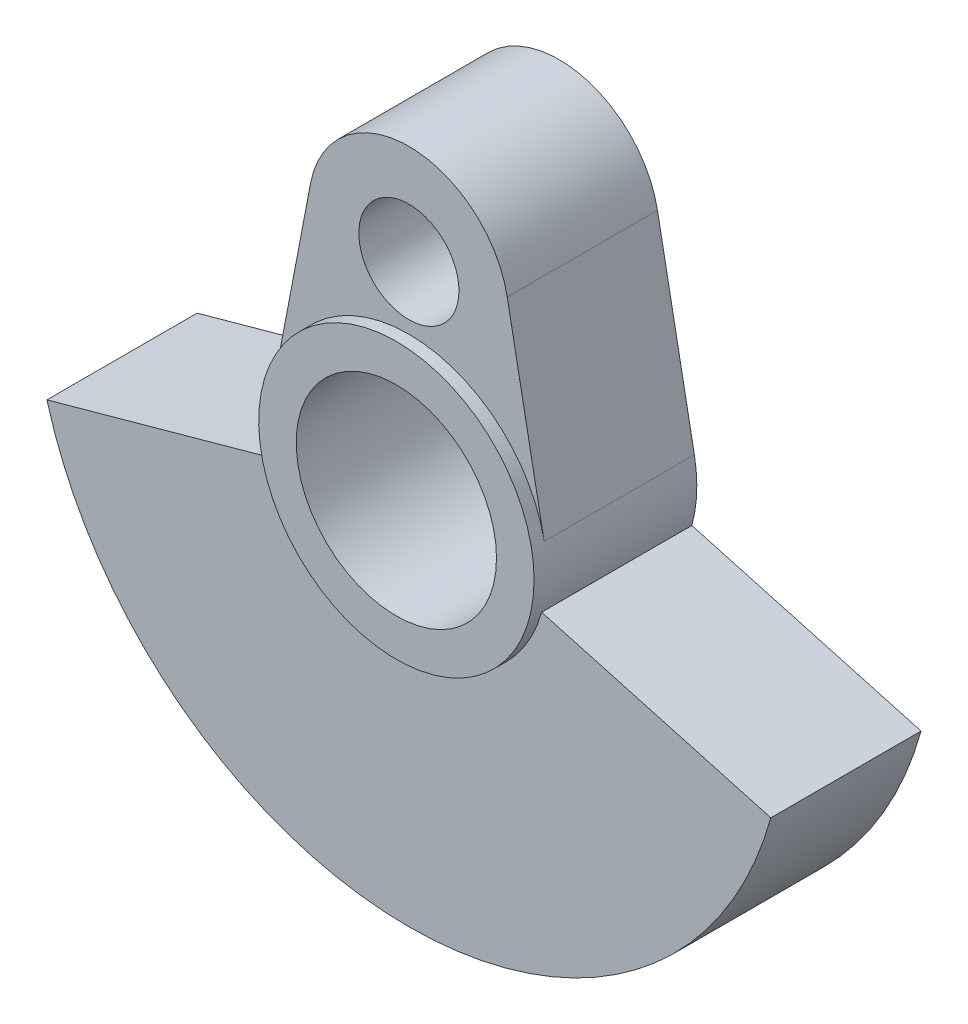
ISO-10303-21;
HEADER;
FILE_DESCRIPTION(('STEP AP214'),'2;1');
FILE_NAME('part.step','',(''),(''),'','','');
FILE_SCHEMA(('AUTOMOTIVE_DESIGN { 1 0 10303 214 1 1 1 1 }'));
ENDSEC;
DATA;
#1=APPLICATION_CONTEXT('core data for automotive mechanical design processes');
#2=APPLICATION_PROTOCOL_DEFINITION('international standard','automotive_design',2000,#1);
#3=PRODUCT_CONTEXT('',#1,'mechanical');
#4=PRODUCT('Part','Part','',(#3));
#5=PRODUCT_RELATED_PRODUCT_CATEGORY('part','',(#4));
#6=PRODUCT_DEFINITION_FORMATION('','',#4);
#7=PRODUCT_DEFINITION_CONTEXT('part definition',#1,'design');
#8=PRODUCT_DEFINITION('design','',#6,#7);
#9=PRODUCT_DEFINITION_SHAPE('','',#8);
#10=(LENGTH_UNIT() NAMED_UNIT(*) SI_UNIT(.MILLI.,.METRE.));
#11=(NAMED_UNIT(*) PLANE_ANGLE_UNIT() SI_UNIT($,.RADIAN.));
#12=(NAMED_UNIT(*) SI_UNIT($,.STERADIAN.) SOLID_ANGLE_UNIT());
#13=UNCERTAINTY_MEASURE_WITH_UNIT(LENGTH_MEASURE(1.E-05),#10,'distance_accuracy_value','');
#14=(GEOMETRIC_REPRESENTATION_CONTEXT(3) GLOBAL_UNCERTAINTY_ASSIGNED_CONTEXT((#13)) GLOBAL_UNIT_ASSIGNED_CONTEXT((#10,
#11,#12)) REPRESENTATION_CONTEXT('',''));
#15=CARTESIAN_POINT('',(0.,0.,0.));
#16=DIRECTION('',(0.,0.,1.));
#17=DIRECTION('',(1.,0.,0.));
#18=AXIS2_PLACEMENT_3D('',#15,#16,#17);
#19=CARTESIAN_POINT('',(0.,-8.,6.));
#20=DIRECTION('',(0.,0.,1.));
#21=DIRECTION('',(1.,0.,0.));
#22=AXIS2_PLACEMENT_3D('',#19,#20,#21);
#23=PLANE('',#22);
#24=CARTESIAN_POINT('',(0.,-8.,6.));
#25=DIRECTION('',(0.,0.,1.));
#26=DIRECTION('',(1.,0.,0.));
#27=AXIS2_PLACEMENT_3D('',#24,#25,#26);
#28=CIRCLE('',#27,5.5);
#29=CARTESIAN_POINT('',(5.40245531564122,-6.96875,6.));
#30=VERTEX_POINT('',#29);
#31=CARTESIAN_POINT('',(-5.40245531564121,-6.96875,6.));
#32=VERTEX_POINT('',#31);
#33=EDGE_CURVE('E56',#30,#32,#28,.T.);
#34=ORIENTED_EDGE('',*,*,#33,.F.);
#35=DIRECTION('',(-0.1875,0.982264602843857,0.));
#36=VECTOR('',#35,1.);
#37=CARTESIAN_POINT('',(5.40245531564122,-6.96875,6.));
#38=LINE('',#37,#36);
#39=CARTESIAN_POINT('',(3.92905841137543,0.75,6.));
#40=VERTEX_POINT('',#39);
#41=EDGE_CURVE('E96',#30,#40,#38,.T.);
#42=ORIENTED_EDGE('',*,*,#41,.T.);
#43=CARTESIAN_POINT('',(0.,0.,6.));
#44=DIRECTION('',(0.,0.,1.));
#45=DIRECTION('',(1.,0.,0.));
#46=AXIS2_PLACEMENT_3D('',#43,#44,#45);
#47=CIRCLE('',#46,4.);
#48=CARTESIAN_POINT('',(-3.92905841137543,0.749999999999999,6.));
#49=VERTEX_POINT('',#48);
#50=EDGE_CURVE('E135',#40,#49,#47,.T.);
#51=ORIENTED_EDGE('',*,*,#50,.T.);
#52=DIRECTION('',(-0.1875,-0.982264602843857,0.));
#53=VECTOR('',#52,1.);
#54=CARTESIAN_POINT('',(-5.40245531564121,-6.96875,6.));
#55=LINE('',#54,#53);
#56=EDGE_CURVE('E72',#49,#32,#55,.T.);
#57=ORIENTED_EDGE('',*,*,#56,.T.);
#58=EDGE_LOOP('',(#34,#42,#51,#57));
#59=FACE_BOUND('',#58,.T.);
#60=CARTESIAN_POINT('',(0.,0.,6.));
#61=DIRECTION('',(0.,0.,1.));
#62=DIRECTION('',(1.,0.,0.));
#63=AXIS2_PLACEMENT_3D('',#60,#61,#62);
#64=CIRCLE('',#63,2.);
#65=CARTESIAN_POINT('',(2.,0.,6.));
#66=VERTEX_POINT('',#65);
#67=EDGE_CURVE('E185',#66,#66,#64,.T.);
#68=ORIENTED_EDGE('',*,*,#67,.F.);
#69=EDGE_LOOP('',(#68));
#70=FACE_BOUND('',#69,.T.);
#71=ADVANCED_FACE('F45',(#59,#70),#23,.T.);
#72=CARTESIAN_POINT('',(-5.30083850809369,-9.46666666666666,6.));
#73=VERTEX_POINT('',#72);
#74=CARTESIAN_POINT('',(5.30083850809369,-9.46666666666667,6.));
#75=VERTEX_POINT('',#74);
#76=EDGE_CURVE('E11',#73,#75,#28,.T.);
#77=ORIENTED_EDGE('',*,*,#76,.F.);
#78=DIRECTION('',(0.963788819653397,0.266666666666668,0.));
#79=VECTOR('',#78,1.);
#80=CARTESIAN_POINT('',(2.05608281526059,-7.43111111111109,6.));
#81=LINE('',#80,#79);
#82=CARTESIAN_POINT('',(-14.456832294801,-12.,6.));
#83=VERTEX_POINT('',#82);
#84=EDGE_CURVE('E144',#83,#73,#81,.T.);
#85=ORIENTED_EDGE('',*,*,#84,.F.);
#86=CARTESIAN_POINT('',(0.,-8.,6.));
#87=DIRECTION('',(0.,0.,1.));
#88=DIRECTION('',(1.,0.,0.));
#89=AXIS2_PLACEMENT_3D('',#86,#87,#88);
#90=CIRCLE('',#89,15.);
#91=CARTESIAN_POINT('',(14.456832294801,-12.,6.));
#92=VERTEX_POINT('',#91);
#93=EDGE_CURVE('E163',#83,#92,#90,.T.);
#94=ORIENTED_EDGE('',*,*,#93,.T.);
#95=DIRECTION('',(-0.963788819653397,0.266666666666667,0.));
#96=VECTOR('',#95,1.);
#97=CARTESIAN_POINT('',(-2.05608281526058,-7.43111111111111,6.));
#98=LINE('',#97,#96);
#99=EDGE_CURVE('E63',#92,#75,#98,.T.);
#100=ORIENTED_EDGE('',*,*,#99,.T.);
#101=EDGE_LOOP('',(#77,#85,#94,#100));
#102=FACE_BOUND('',#101,.T.);
#103=ADVANCED_FACE('F239',(#102),#23,.T.);
#104=CARTESIAN_POINT('',(0.,-8.,0.));
#105=DIRECTION('',(0.,0.,1.));
#106=DIRECTION('',(1.,0.,0.));
#107=AXIS2_PLACEMENT_3D('',#104,#105,#106);
#108=PLANE('',#107);
#109=CARTESIAN_POINT('',(0.,-8.,0.));
#110=DIRECTION('',(0.,0.,1.));
#111=DIRECTION('',(1.,0.,0.));
#112=AXIS2_PLACEMENT_3D('',#109,#110,#111);
#113=CIRCLE('',#112,5.5);
#114=CARTESIAN_POINT('',(-5.40245531564121,-6.96875,0.));
#115=VERTEX_POINT('',#114);
#116=CARTESIAN_POINT('',(-5.30083850809369,-9.46666666666666,0.));
#117=VERTEX_POINT('',#116);
#118=EDGE_CURVE('E197',#115,#117,#113,.T.);
#119=ORIENTED_EDGE('',*,*,#118,.F.);
#120=DIRECTION('',(-0.1875,-0.982264602843857,0.));
#121=VECTOR('',#120,1.);
#122=CARTESIAN_POINT('',(-5.40245531564121,-6.96875,0.));
#123=LINE('',#122,#121);
#124=CARTESIAN_POINT('',(-3.92905841137543,0.749999999999999,0.));
#125=VERTEX_POINT('',#124);
#126=EDGE_CURVE('E92',#125,#115,#123,.T.);
#127=ORIENTED_EDGE('',*,*,#126,.F.);
#128=CARTESIAN_POINT('',(0.,0.,0.));
#129=DIRECTION('',(0.,0.,1.));
#130=DIRECTION('',(1.,0.,0.));
#131=AXIS2_PLACEMENT_3D('',#128,#129,#130);
#132=CIRCLE('',#131,4.);
#133=CARTESIAN_POINT('',(3.92905841137543,0.75,0.));
#134=VERTEX_POINT('',#133);
#135=EDGE_CURVE('E204',#134,#125,#132,.T.);
#136=ORIENTED_EDGE('',*,*,#135,.F.);
#137=DIRECTION('',(-0.1875,0.982264602843857,0.));
#138=VECTOR('',#137,1.);
#139=CARTESIAN_POINT('',(5.40245531564122,-6.96875,0.));
#140=LINE('',#139,#138);
#141=CARTESIAN_POINT('',(5.40245531564122,-6.96875,0.));
#142=VERTEX_POINT('',#141);
#143=EDGE_CURVE('E201',#142,#134,#140,.T.);
#144=ORIENTED_EDGE('',*,*,#143,.F.);
#145=CARTESIAN_POINT('',(5.30083850809369,-9.46666666666667,0.));
#146=VERTEX_POINT('',#145);
#147=EDGE_CURVE('E126',#146,#142,#113,.T.);
#148=ORIENTED_EDGE('',*,*,#147,.F.);
#149=DIRECTION('',(-0.963788819653397,0.266666666666667,0.));
#150=VECTOR('',#149,1.);
#151=CARTESIAN_POINT('',(-2.05608281526058,-7.43111111111111,0.));
#152=LINE('',#151,#150);
#153=CARTESIAN_POINT('',(14.456832294801,-12.,0.));
#154=VERTEX_POINT('',#153);
#155=EDGE_CURVE('E156',#154,#146,#152,.T.);
#156=ORIENTED_EDGE('',*,*,#155,.F.);
#157=CARTESIAN_POINT('',(0.,-8.,0.));
#158=DIRECTION('',(0.,0.,1.));
#159=DIRECTION('',(1.,0.,0.));
#160=AXIS2_PLACEMENT_3D('',#157,#158,#159);
#161=CIRCLE('',#160,15.);
#162=CARTESIAN_POINT('',(-14.456832294801,-12.,0.));
#163=VERTEX_POINT('',#162);
#164=EDGE_CURVE('E152',#163,#154,#161,.T.);
#165=ORIENTED_EDGE('',*,*,#164,.F.);
#166=DIRECTION('',(0.963788819653397,0.266666666666668,0.));
#167=VECTOR('',#166,1.);
#168=CARTESIAN_POINT('',(2.05608281526059,-7.43111111111109,0.));
#169=LINE('',#168,#167);
#170=EDGE_CURVE('E149',#163,#117,#169,.T.);
#171=ORIENTED_EDGE('',*,*,#170,.T.);
#172=EDGE_LOOP('',(#119,#127,#136,#144,#148,#156,#165,#171));
#173=FACE_BOUND('',#172,.T.);
#174=CARTESIAN_POINT('',(0.,0.,0.));
#175=DIRECTION('',(0.,0.,1.));
#176=DIRECTION('',(1.,0.,0.));
#177=AXIS2_PLACEMENT_3D('',#174,#175,#176);
#178=CIRCLE('',#177,2.);
#179=CARTESIAN_POINT('',(2.,0.,0.));
#180=VERTEX_POINT('',#179);
#181=EDGE_CURVE('E184',#180,#180,#178,.T.);
#182=ORIENTED_EDGE('',*,*,#181,.T.);
#183=EDGE_LOOP('',(#182));
#184=FACE_BOUND('',#183,.T.);
#185=CARTESIAN_POINT('',(0.,-8.,0.));
#186=DIRECTION('',(0.,0.,1.));
#187=DIRECTION('',(1.,0.,0.));
#188=AXIS2_PLACEMENT_3D('',#185,#186,#187);
#189=CIRCLE('',#188,4.);
#190=CARTESIAN_POINT('',(4.,-8.,0.));
#191=VERTEX_POINT('',#190);
#192=EDGE_CURVE('E171',#191,#191,#189,.T.);
#193=ORIENTED_EDGE('',*,*,#192,.T.);
#194=EDGE_LOOP('',(#193));
#195=FACE_BOUND('',#194,.T.);
#196=ADVANCED_FACE('F220',(#173,#184,#195),#108,.F.);
#197=CARTESIAN_POINT('',(0.,-8.,6.));
#198=DIRECTION('',(0.,0.,-1.));
#199=DIRECTION('',(-1.,0.,0.));
#200=AXIS2_PLACEMENT_3D('',#197,#198,#199);
#201=CYLINDRICAL_SURFACE('',#200,5.5);
#202=DIRECTION('',(0.,0.,-1.));
#203=VECTOR('',#202,1.);
#204=CARTESIAN_POINT('',(5.40245531564122,-6.96875,6.));
#205=LINE('',#204,#203);
#206=EDGE_CURVE('E49',#30,#142,#205,.T.);
#207=ORIENTED_EDGE('',*,*,#206,.F.);
#208=ORIENTED_EDGE('',*,*,#33,.T.);
#209=DIRECTION('',(0.,0.,-1.));
#210=VECTOR('',#209,1.);
#211=CARTESIAN_POINT('',(-5.40245531564121,-6.96875,6.));
#212=LINE('',#211,#210);
#213=EDGE_CURVE('E196',#32,#115,#212,.T.);
#214=ORIENTED_EDGE('',*,*,#213,.T.);
#215=ORIENTED_EDGE('',*,*,#118,.T.);
#216=DIRECTION('',(0.,0.,1.));
#217=VECTOR('',#216,1.);
#218=CARTESIAN_POINT('',(-5.30083850809369,-9.46666666666666,0.));
#219=LINE('',#218,#217);
#220=EDGE_CURVE('E159',#117,#73,#219,.T.);
#221=ORIENTED_EDGE('',*,*,#220,.T.);
#222=ORIENTED_EDGE('',*,*,#76,.T.);
#223=DIRECTION('',(0.,0.,1.));
#224=VECTOR('',#223,1.);
#225=CARTESIAN_POINT('',(5.30083850809369,-9.46666666666667,0.));
#226=LINE('',#225,#224);
#227=EDGE_CURVE('E168',#146,#75,#226,.T.);
#228=ORIENTED_EDGE('',*,*,#227,.F.);
#229=ORIENTED_EDGE('',*,*,#147,.T.);
#230=EDGE_LOOP('',(#207,#208,#214,#215,#221,#222,#228,#229));
#231=FACE_BOUND('',#230,.T.);
#232=CARTESIAN_POINT('',(0.,-8.,6.5));
#233=DIRECTION('',(0.,0.,1.));
#234=DIRECTION('',(1.,0.,0.));
#235=AXIS2_PLACEMENT_3D('',#232,#233,#234);
#236=CIRCLE('',#235,5.5);
#237=CARTESIAN_POINT('',(5.5,-8.,6.5));
#238=VERTEX_POINT('',#237);
#239=EDGE_CURVE('E139',#238,#238,#236,.T.);
#240=ORIENTED_EDGE('',*,*,#239,.F.);
#241=EDGE_LOOP('',(#240));
#242=FACE_BOUND('',#241,.T.);
#243=ADVANCED_FACE('F47',(#231,#242),#201,.T.);
#244=CARTESIAN_POINT('',(5.40245531564122,-6.96875,6.));
#245=DIRECTION('',(-0.982264602843857,-0.1875,0.));
#246=DIRECTION('',(0.1875,-0.982264602843857,0.));
#247=AXIS2_PLACEMENT_3D('',#244,#245,#246);
#248=PLANE('',#247);
#249=ORIENTED_EDGE('',*,*,#143,.T.);
#250=DIRECTION('',(0.,0.,-1.));
#251=VECTOR('',#250,1.);
#252=CARTESIAN_POINT('',(3.92905841137543,0.75,6.));
#253=LINE('',#252,#251);
#254=EDGE_CURVE('E130',#40,#134,#253,.T.);
#255=ORIENTED_EDGE('',*,*,#254,.F.);
#256=ORIENTED_EDGE('',*,*,#41,.F.);
#257=ORIENTED_EDGE('',*,*,#206,.T.);
#258=EDGE_LOOP('',(#249,#255,#256,#257));
#259=FACE_BOUND('',#258,.T.);
#260=ADVANCED_FACE('F131',(#259),#248,.F.);
#261=CARTESIAN_POINT('',(0.,0.,6.));
#262=DIRECTION('',(0.,0.,-1.));
#263=DIRECTION('',(-1.,0.,0.));
#264=AXIS2_PLACEMENT_3D('',#261,#262,#263);
#265=CYLINDRICAL_SURFACE('',#264,4.);
#266=ORIENTED_EDGE('',*,*,#135,.T.);
#267=DIRECTION('',(0.,0.,-1.));
#268=VECTOR('',#267,1.);
#269=CARTESIAN_POINT('',(-3.92905841137543,0.749999999999999,6.));
#270=LINE('',#269,#268);
#271=EDGE_CURVE('E211',#49,#125,#270,.T.);
#272=ORIENTED_EDGE('',*,*,#271,.F.);
#273=ORIENTED_EDGE('',*,*,#50,.F.);
#274=ORIENTED_EDGE('',*,*,#254,.T.);
#275=EDGE_LOOP('',(#266,#272,#273,#274));
#276=FACE_BOUND('',#275,.T.);
#277=ADVANCED_FACE('F216',(#276),#265,.T.);
#278=CARTESIAN_POINT('',(-5.40245531564121,-6.96875,6.));
#279=DIRECTION('',(0.982264602843857,-0.1875,0.));
#280=DIRECTION('',(0.1875,0.982264602843857,0.));
#281=AXIS2_PLACEMENT_3D('',#278,#279,#280);
#282=PLANE('',#281);
#283=ORIENTED_EDGE('',*,*,#126,.T.);
#284=ORIENTED_EDGE('',*,*,#213,.F.);
#285=ORIENTED_EDGE('',*,*,#56,.F.);
#286=ORIENTED_EDGE('',*,*,#271,.T.);
#287=EDGE_LOOP('',(#283,#284,#285,#286));
#288=FACE_BOUND('',#287,.T.);
#289=ADVANCED_FACE('F225',(#288),#282,.F.);
#290=CARTESIAN_POINT('',(0.,0.,6.));
#291=DIRECTION('',(0.,0.,-1.));
#292=DIRECTION('',(-1.,0.,0.));
#293=AXIS2_PLACEMENT_3D('',#290,#291,#292);
#294=CYLINDRICAL_SURFACE('',#293,2.);
#295=ORIENTED_EDGE('',*,*,#67,.T.);
#296=EDGE_LOOP('',(#295));
#297=FACE_BOUND('',#296,.T.);
#298=ORIENTED_EDGE('',*,*,#181,.F.);
#299=EDGE_LOOP('',(#298));
#300=FACE_BOUND('',#299,.T.);
#301=ADVANCED_FACE('F227',(#297,#300),#294,.F.);
#302=CARTESIAN_POINT('',(0.,-8.,6.));
#303=DIRECTION('',(0.,0.,-1.));
#304=DIRECTION('',(-1.,0.,0.));
#305=AXIS2_PLACEMENT_3D('',#302,#303,#304);
#306=CYLINDRICAL_SURFACE('',#305,4.);
#307=ORIENTED_EDGE('',*,*,#192,.F.);
#308=EDGE_LOOP('',(#307));
#309=FACE_BOUND('',#308,.T.);
#310=CARTESIAN_POINT('',(0.,-8.,6.5));
#311=DIRECTION('',(0.,0.,1.));
#312=DIRECTION('',(1.,0.,0.));
#313=AXIS2_PLACEMENT_3D('',#310,#311,#312);
#314=CIRCLE('',#313,4.);
#315=CARTESIAN_POINT('',(4.,-8.,6.5));
#316=VERTEX_POINT('',#315);
#317=EDGE_CURVE('E140',#316,#316,#314,.T.);
#318=ORIENTED_EDGE('',*,*,#317,.T.);
#319=EDGE_LOOP('',(#318));
#320=FACE_BOUND('',#319,.T.);
#321=ADVANCED_FACE('F233',(#309,#320),#306,.F.);
#322=CARTESIAN_POINT('',(-2.05608281526058,-7.43111111111111,0.));
#323=DIRECTION('',(0.266666666666667,0.963788819653397,0.));
#324=DIRECTION('',(-0.963788819653397,0.266666666666667,0.));
#325=AXIS2_PLACEMENT_3D('',#322,#323,#324);
#326=PLANE('',#325);
#327=ORIENTED_EDGE('',*,*,#99,.F.);
#328=DIRECTION('',(0.,0.,1.));
#329=VECTOR('',#328,1.);
#330=CARTESIAN_POINT('',(14.456832294801,-12.,0.));
#331=LINE('',#330,#329);
#332=EDGE_CURVE('E172',#154,#92,#331,.T.);
#333=ORIENTED_EDGE('',*,*,#332,.F.);
#334=ORIENTED_EDGE('',*,*,#155,.T.);
#335=ORIENTED_EDGE('',*,*,#227,.T.);
#336=EDGE_LOOP('',(#327,#333,#334,#335));
#337=FACE_BOUND('',#336,.T.);
#338=ADVANCED_FACE('F285',(#337),#326,.T.);
#339=CARTESIAN_POINT('',(0.,-8.,0.));
#340=DIRECTION('',(0.,0.,1.));
#341=DIRECTION('',(1.,0.,0.));
#342=AXIS2_PLACEMENT_3D('',#339,#340,#341);
#343=CYLINDRICAL_SURFACE('',#342,15.);
#344=ORIENTED_EDGE('',*,*,#93,.F.);
#345=DIRECTION('',(0.,0.,1.));
#346=VECTOR('',#345,1.);
#347=CARTESIAN_POINT('',(-14.456832294801,-12.,0.));
#348=LINE('',#347,#346);
#349=EDGE_CURVE('E175',#163,#83,#348,.T.);
#350=ORIENTED_EDGE('',*,*,#349,.F.);
#351=ORIENTED_EDGE('',*,*,#164,.T.);
#352=ORIENTED_EDGE('',*,*,#332,.T.);
#353=EDGE_LOOP('',(#344,#350,#351,#352));
#354=FACE_BOUND('',#353,.T.);
#355=ADVANCED_FACE('F280',(#354),#343,.T.);
#356=CARTESIAN_POINT('',(2.05608281526059,-7.43111111111109,0.));
#357=DIRECTION('',(0.266666666666668,-0.963788819653397,0.));
#358=DIRECTION('',(0.963788819653397,0.266666666666668,0.));
#359=AXIS2_PLACEMENT_3D('',#356,#357,#358);
#360=PLANE('',#359);
#361=ORIENTED_EDGE('',*,*,#84,.T.);
#362=ORIENTED_EDGE('',*,*,#220,.F.);
#363=ORIENTED_EDGE('',*,*,#170,.F.);
#364=ORIENTED_EDGE('',*,*,#349,.T.);
#365=EDGE_LOOP('',(#361,#362,#363,#364));
#366=FACE_BOUND('',#365,.T.);
#367=ADVANCED_FACE('F284',(#366),#360,.F.);
#368=CARTESIAN_POINT('',(0.,-8.,6.5));
#369=DIRECTION('',(0.,0.,1.));
#370=DIRECTION('',(1.,0.,0.));
#371=AXIS2_PLACEMENT_3D('',#368,#369,#370);
#372=PLANE('',#371);
#373=ORIENTED_EDGE('',*,*,#239,.T.);
#374=EDGE_LOOP('',(#373));
#375=FACE_BOUND('',#374,.T.);
#376=ORIENTED_EDGE('',*,*,#317,.F.);
#377=EDGE_LOOP('',(#376));
#378=FACE_BOUND('',#377,.T.);
#379=ADVANCED_FACE('F336',(#375,#378),#372,.T.);
#380=CLOSED_SHELL('',(#71,#103,#196,#243,#260,#277,#289,#301,#321,#338,#355,#367,#379));
#381=MANIFOLD_SOLID_BREP('B2',#380);
#382=ADVANCED_BREP_SHAPE_REPRESENTATION('',(#18,#381),#14);
#383=SHAPE_DEFINITION_REPRESENTATION(#9,#382);
ENDSEC;
END-ISO-10303-21;
